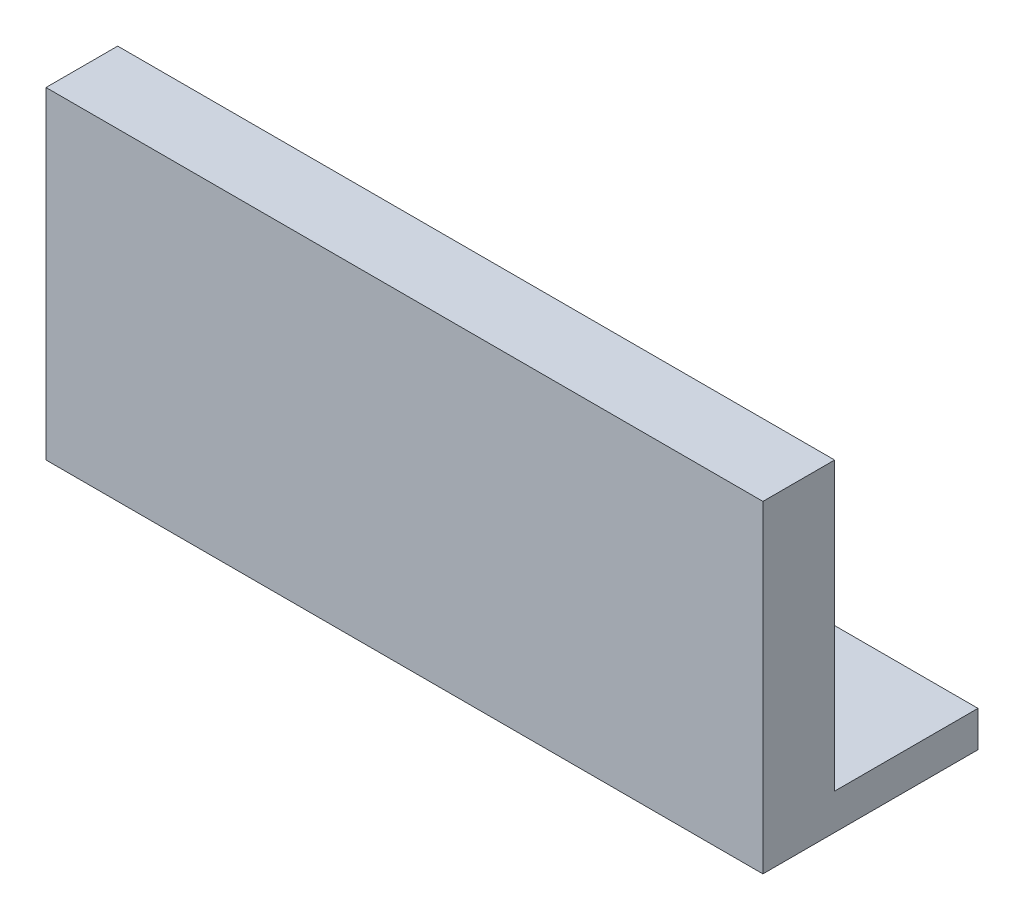
ISO-10303-21;
HEADER;
FILE_DESCRIPTION(('STEP AP214'),'2;1');
FILE_NAME('part.step','',(''),(''),'','','');
FILE_SCHEMA(('AUTOMOTIVE_DESIGN { 1 0 10303 214 1 1 1 1 }'));
ENDSEC;
DATA;
#1=APPLICATION_CONTEXT('core data for automotive mechanical design processes');
#2=APPLICATION_PROTOCOL_DEFINITION('international standard','automotive_design',2000,#1);
#3=PRODUCT_CONTEXT('',#1,'mechanical');
#4=PRODUCT('Part','Part','',(#3));
#5=PRODUCT_RELATED_PRODUCT_CATEGORY('part','',(#4));
#6=PRODUCT_DEFINITION_FORMATION('','',#4);
#7=PRODUCT_DEFINITION_CONTEXT('part definition',#1,'design');
#8=PRODUCT_DEFINITION('design','',#6,#7);
#9=PRODUCT_DEFINITION_SHAPE('','',#8);
#10=(LENGTH_UNIT() NAMED_UNIT(*) SI_UNIT(.MILLI.,.METRE.));
#11=(NAMED_UNIT(*) PLANE_ANGLE_UNIT() SI_UNIT($,.RADIAN.));
#12=(NAMED_UNIT(*) SI_UNIT($,.STERADIAN.) SOLID_ANGLE_UNIT());
#13=UNCERTAINTY_MEASURE_WITH_UNIT(LENGTH_MEASURE(1.E-05),#10,'distance_accuracy_value','');
#14=(GEOMETRIC_REPRESENTATION_CONTEXT(3) GLOBAL_UNCERTAINTY_ASSIGNED_CONTEXT((#13)) GLOBAL_UNIT_ASSIGNED_CONTEXT((#10,
#11,#12)) REPRESENTATION_CONTEXT('',''));
#15=CARTESIAN_POINT('',(0.,0.,0.));
#16=DIRECTION('',(0.,0.,1.));
#17=DIRECTION('',(1.,0.,0.));
#18=AXIS2_PLACEMENT_3D('',#15,#16,#17);
#19=CARTESIAN_POINT('',(1000.,0.,-300.));
#20=DIRECTION('',(0.,1.,0.));
#21=DIRECTION('',(0.,0.,1.));
#22=AXIS2_PLACEMENT_3D('',#19,#20,#21);
#23=PLANE('',#22);
#24=DIRECTION('',(0.,0.,-1.));
#25=VECTOR('',#24,1.);
#26=CARTESIAN_POINT('',(0.,0.,-300.));
#27=LINE('',#26,#25);
#28=CARTESIAN_POINT('',(0.,0.,0.));
#29=VERTEX_POINT('',#28);
#30=CARTESIAN_POINT('',(0.,0.,-300.));
#31=VERTEX_POINT('',#30);
#32=EDGE_CURVE('E128',#29,#31,#27,.T.);
#33=ORIENTED_EDGE('',*,*,#32,.T.);
#34=DIRECTION('',(-1.,0.,0.));
#35=VECTOR('',#34,1.);
#36=CARTESIAN_POINT('',(1000.,0.,-300.));
#37=LINE('',#36,#35);
#38=CARTESIAN_POINT('',(1000.,0.,-300.));
#39=VERTEX_POINT('',#38);
#40=EDGE_CURVE('E11',#39,#31,#37,.T.);
#41=ORIENTED_EDGE('',*,*,#40,.F.);
#42=DIRECTION('',(0.,0.,-1.));
#43=VECTOR('',#42,1.);
#44=CARTESIAN_POINT('',(1000.,0.,-300.));
#45=LINE('',#44,#43);
#46=CARTESIAN_POINT('',(1000.,0.,0.));
#47=VERTEX_POINT('',#46);
#48=EDGE_CURVE('E144',#47,#39,#45,.T.);
#49=ORIENTED_EDGE('',*,*,#48,.F.);
#50=DIRECTION('',(-1.,0.,0.));
#51=VECTOR('',#50,1.);
#52=CARTESIAN_POINT('',(1000.,0.,0.));
#53=LINE('',#52,#51);
#54=EDGE_CURVE('E124',#47,#29,#53,.T.);
#55=ORIENTED_EDGE('',*,*,#54,.T.);
#56=EDGE_LOOP('',(#33,#41,#49,#55));
#57=FACE_BOUND('',#56,.T.);
#58=ADVANCED_FACE('F39',(#57),#23,.F.);
#59=CARTESIAN_POINT('',(1000.,50.,-300.));
#60=DIRECTION('',(0.,0.,1.));
#61=DIRECTION('',(0.,-1.,0.));
#62=AXIS2_PLACEMENT_3D('',#59,#60,#61);
#63=PLANE('',#62);
#64=DIRECTION('',(0.,1.,0.));
#65=VECTOR('',#64,1.);
#66=CARTESIAN_POINT('',(0.,50.,-300.));
#67=LINE('',#66,#65);
#68=CARTESIAN_POINT('',(0.,50.,-300.));
#69=VERTEX_POINT('',#68);
#70=EDGE_CURVE('E132',#31,#69,#67,.T.);
#71=ORIENTED_EDGE('',*,*,#70,.T.);
#72=DIRECTION('',(-1.,0.,0.));
#73=VECTOR('',#72,1.);
#74=CARTESIAN_POINT('',(1000.,50.,-300.));
#75=LINE('',#74,#73);
#76=CARTESIAN_POINT('',(1000.,50.,-300.));
#77=VERTEX_POINT('',#76);
#78=EDGE_CURVE('E48',#77,#69,#75,.T.);
#79=ORIENTED_EDGE('',*,*,#78,.F.);
#80=DIRECTION('',(0.,1.,0.));
#81=VECTOR('',#80,1.);
#82=CARTESIAN_POINT('',(1000.,50.,-300.));
#83=LINE('',#82,#81);
#84=EDGE_CURVE('E93',#39,#77,#83,.T.);
#85=ORIENTED_EDGE('',*,*,#84,.F.);
#86=ORIENTED_EDGE('',*,*,#40,.T.);
#87=EDGE_LOOP('',(#71,#79,#85,#86));
#88=FACE_BOUND('',#87,.T.);
#89=ADVANCED_FACE('F172',(#88),#63,.F.);
#90=CARTESIAN_POINT('',(1000.,50.,-100.));
#91=DIRECTION('',(0.,-1.,0.));
#92=DIRECTION('',(0.,0.,-1.));
#93=AXIS2_PLACEMENT_3D('',#90,#91,#92);
#94=PLANE('',#93);
#95=DIRECTION('',(0.,0.,1.));
#96=VECTOR('',#95,1.);
#97=CARTESIAN_POINT('',(0.,50.,-100.));
#98=LINE('',#97,#96);
#99=CARTESIAN_POINT('',(0.,50.,-100.));
#100=VERTEX_POINT('',#99);
#101=EDGE_CURVE('E135',#69,#100,#98,.T.);
#102=ORIENTED_EDGE('',*,*,#101,.T.);
#103=DIRECTION('',(-1.,0.,0.));
#104=VECTOR('',#103,1.);
#105=CARTESIAN_POINT('',(1000.,50.,-100.));
#106=LINE('',#105,#104);
#107=CARTESIAN_POINT('',(1000.,50.,-100.));
#108=VERTEX_POINT('',#107);
#109=EDGE_CURVE('E117',#108,#100,#106,.T.);
#110=ORIENTED_EDGE('',*,*,#109,.F.);
#111=DIRECTION('',(0.,0.,1.));
#112=VECTOR('',#111,1.);
#113=CARTESIAN_POINT('',(1000.,50.,-100.));
#114=LINE('',#113,#112);
#115=EDGE_CURVE('E106',#77,#108,#114,.T.);
#116=ORIENTED_EDGE('',*,*,#115,.F.);
#117=ORIENTED_EDGE('',*,*,#78,.T.);
#118=EDGE_LOOP('',(#102,#110,#116,#117));
#119=FACE_BOUND('',#118,.T.);
#120=ADVANCED_FACE('F154',(#119),#94,.F.);
#121=CARTESIAN_POINT('',(1000.,450.,-100.));
#122=DIRECTION('',(0.,0.,1.));
#123=DIRECTION('',(0.,-1.,0.));
#124=AXIS2_PLACEMENT_3D('',#121,#122,#123);
#125=PLANE('',#124);
#126=DIRECTION('',(0.,1.,0.));
#127=VECTOR('',#126,1.);
#128=CARTESIAN_POINT('',(0.,450.,-100.));
#129=LINE('',#128,#127);
#130=CARTESIAN_POINT('',(0.,450.,-100.));
#131=VERTEX_POINT('',#130);
#132=EDGE_CURVE('E115',#100,#131,#129,.T.);
#133=ORIENTED_EDGE('',*,*,#132,.T.);
#134=DIRECTION('',(-1.,0.,0.));
#135=VECTOR('',#134,1.);
#136=CARTESIAN_POINT('',(1000.,450.,-100.));
#137=LINE('',#136,#135);
#138=CARTESIAN_POINT('',(1000.,450.,-100.));
#139=VERTEX_POINT('',#138);
#140=EDGE_CURVE('E112',#139,#131,#137,.T.);
#141=ORIENTED_EDGE('',*,*,#140,.F.);
#142=DIRECTION('',(0.,1.,0.));
#143=VECTOR('',#142,1.);
#144=CARTESIAN_POINT('',(1000.,450.,-100.));
#145=LINE('',#144,#143);
#146=EDGE_CURVE('E100',#108,#139,#145,.T.);
#147=ORIENTED_EDGE('',*,*,#146,.F.);
#148=ORIENTED_EDGE('',*,*,#109,.T.);
#149=EDGE_LOOP('',(#133,#141,#147,#148));
#150=FACE_BOUND('',#149,.T.);
#151=ADVANCED_FACE('F113',(#150),#125,.F.);
#152=CARTESIAN_POINT('',(1000.,450.,0.));
#153=DIRECTION('',(0.,-1.,0.));
#154=DIRECTION('',(0.,0.,-1.));
#155=AXIS2_PLACEMENT_3D('',#152,#153,#154);
#156=PLANE('',#155);
#157=DIRECTION('',(0.,0.,1.));
#158=VECTOR('',#157,1.);
#159=CARTESIAN_POINT('',(0.,450.,0.));
#160=LINE('',#159,#158);
#161=CARTESIAN_POINT('',(0.,450.,0.));
#162=VERTEX_POINT('',#161);
#163=EDGE_CURVE('E79',#131,#162,#160,.T.);
#164=ORIENTED_EDGE('',*,*,#163,.T.);
#165=DIRECTION('',(-1.,0.,0.));
#166=VECTOR('',#165,1.);
#167=CARTESIAN_POINT('',(1000.,450.,0.));
#168=LINE('',#167,#166);
#169=CARTESIAN_POINT('',(1000.,450.,0.));
#170=VERTEX_POINT('',#169);
#171=EDGE_CURVE('E118',#170,#162,#168,.T.);
#172=ORIENTED_EDGE('',*,*,#171,.F.);
#173=DIRECTION('',(0.,0.,1.));
#174=VECTOR('',#173,1.);
#175=CARTESIAN_POINT('',(1000.,450.,0.));
#176=LINE('',#175,#174);
#177=EDGE_CURVE('E104',#139,#170,#176,.T.);
#178=ORIENTED_EDGE('',*,*,#177,.F.);
#179=ORIENTED_EDGE('',*,*,#140,.T.);
#180=EDGE_LOOP('',(#164,#172,#178,#179));
#181=FACE_BOUND('',#180,.T.);
#182=ADVANCED_FACE('F120',(#181),#156,.F.);
#183=CARTESIAN_POINT('',(1000.,0.,0.));
#184=DIRECTION('',(0.,0.,-1.));
#185=DIRECTION('',(-1.,0.,0.));
#186=AXIS2_PLACEMENT_3D('',#183,#184,#185);
#187=PLANE('',#186);
#188=DIRECTION('',(0.,-1.,0.));
#189=VECTOR('',#188,1.);
#190=CARTESIAN_POINT('',(0.,0.,0.));
#191=LINE('',#190,#189);
#192=EDGE_CURVE('E85',#162,#29,#191,.T.);
#193=ORIENTED_EDGE('',*,*,#192,.T.);
#194=ORIENTED_EDGE('',*,*,#54,.F.);
#195=DIRECTION('',(0.,-1.,0.));
#196=VECTOR('',#195,1.);
#197=CARTESIAN_POINT('',(1000.,0.,0.));
#198=LINE('',#197,#196);
#199=EDGE_CURVE('E56',#170,#47,#198,.T.);
#200=ORIENTED_EDGE('',*,*,#199,.F.);
#201=ORIENTED_EDGE('',*,*,#171,.T.);
#202=EDGE_LOOP('',(#193,#194,#200,#201));
#203=FACE_BOUND('',#202,.T.);
#204=ADVANCED_FACE('F161',(#203),#187,.F.);
#205=CARTESIAN_POINT('',(1000.,0.,0.));
#206=DIRECTION('',(-1.,0.,0.));
#207=DIRECTION('',(0.,0.,1.));
#208=AXIS2_PLACEMENT_3D('',#205,#206,#207);
#209=PLANE('',#208);
#210=ORIENTED_EDGE('',*,*,#48,.T.);
#211=ORIENTED_EDGE('',*,*,#84,.T.);
#212=ORIENTED_EDGE('',*,*,#115,.T.);
#213=ORIENTED_EDGE('',*,*,#146,.T.);
#214=ORIENTED_EDGE('',*,*,#177,.T.);
#215=ORIENTED_EDGE('',*,*,#199,.T.);
#216=EDGE_LOOP('',(#210,#211,#212,#213,#214,#215));
#217=FACE_BOUND('',#216,.T.);
#218=ADVANCED_FACE('F102',(#217),#209,.F.);
#219=CARTESIAN_POINT('',(0.,0.,0.));
#220=DIRECTION('',(-1.,0.,0.));
#221=DIRECTION('',(0.,0.,1.));
#222=AXIS2_PLACEMENT_3D('',#219,#220,#221);
#223=PLANE('',#222);
#224=ORIENTED_EDGE('',*,*,#32,.F.);
#225=ORIENTED_EDGE('',*,*,#192,.F.);
#226=ORIENTED_EDGE('',*,*,#163,.F.);
#227=ORIENTED_EDGE('',*,*,#132,.F.);
#228=ORIENTED_EDGE('',*,*,#101,.F.);
#229=ORIENTED_EDGE('',*,*,#70,.F.);
#230=EDGE_LOOP('',(#224,#225,#226,#227,#228,#229));
#231=FACE_BOUND('',#230,.T.);
#232=ADVANCED_FACE('F157',(#231),#223,.T.);
#233=CLOSED_SHELL('',(#58,#89,#120,#151,#182,#204,#218,#232));
#234=MANIFOLD_SOLID_BREP('B2',#233);
#235=ADVANCED_BREP_SHAPE_REPRESENTATION('',(#18,#234),#14);
#236=SHAPE_DEFINITION_REPRESENTATION(#9,#235);
ENDSEC;
END-ISO-10303-21;
